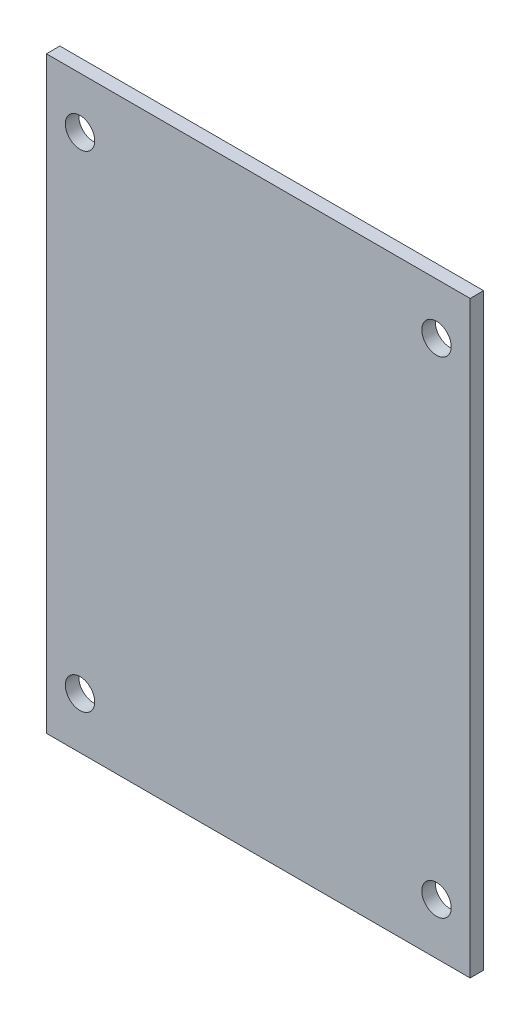
ISO-10303-21;
HEADER;
FILE_DESCRIPTION(('STEP AP214'),'2;1');
FILE_NAME('part.step','',(''),(''),'','','');
FILE_SCHEMA(('AUTOMOTIVE_DESIGN { 1 0 10303 214 1 1 1 1 }'));
ENDSEC;
DATA;
#1=APPLICATION_CONTEXT('core data for automotive mechanical design processes');
#2=APPLICATION_PROTOCOL_DEFINITION('international standard','automotive_design',2000,#1);
#3=PRODUCT_CONTEXT('',#1,'mechanical');
#4=PRODUCT('Part','Part','',(#3));
#5=PRODUCT_RELATED_PRODUCT_CATEGORY('part','',(#4));
#6=PRODUCT_DEFINITION_FORMATION('','',#4);
#7=PRODUCT_DEFINITION_CONTEXT('part definition',#1,'design');
#8=PRODUCT_DEFINITION('design','',#6,#7);
#9=PRODUCT_DEFINITION_SHAPE('','',#8);
#10=(LENGTH_UNIT() NAMED_UNIT(*) SI_UNIT(.MILLI.,.METRE.));
#11=(NAMED_UNIT(*) PLANE_ANGLE_UNIT() SI_UNIT($,.RADIAN.));
#12=(NAMED_UNIT(*) SI_UNIT($,.STERADIAN.) SOLID_ANGLE_UNIT());
#13=UNCERTAINTY_MEASURE_WITH_UNIT(LENGTH_MEASURE(1.E-05),#10,'distance_accuracy_value','');
#14=(GEOMETRIC_REPRESENTATION_CONTEXT(3) GLOBAL_UNCERTAINTY_ASSIGNED_CONTEXT((#13)) GLOBAL_UNIT_ASSIGNED_CONTEXT((#10,
#11,#12)) REPRESENTATION_CONTEXT('',''));
#15=CARTESIAN_POINT('',(0.,0.,0.));
#16=DIRECTION('',(0.,0.,1.));
#17=DIRECTION('',(1.,0.,0.));
#18=AXIS2_PLACEMENT_3D('',#15,#16,#17);
#19=CARTESIAN_POINT('',(0.,0.,1.6));
#20=DIRECTION('',(1.,0.,0.));
#21=DIRECTION('',(0.,0.,-1.));
#22=AXIS2_PLACEMENT_3D('',#19,#20,#21);
#23=PLANE('',#22);
#24=DIRECTION('',(0.,-1.,0.));
#25=VECTOR('',#24,1.);
#26=CARTESIAN_POINT('',(0.,0.,0.));
#27=LINE('',#26,#25);
#28=CARTESIAN_POINT('',(0.,70.,0.));
#29=VERTEX_POINT('',#28);
#30=CARTESIAN_POINT('',(0.,0.,0.));
#31=VERTEX_POINT('',#30);
#32=EDGE_CURVE('E96',#29,#31,#27,.T.);
#33=ORIENTED_EDGE('',*,*,#32,.T.);
#34=DIRECTION('',(0.,0.,-1.));
#35=VECTOR('',#34,1.);
#36=CARTESIAN_POINT('',(0.,0.,1.6));
#37=LINE('',#36,#35);
#38=CARTESIAN_POINT('',(0.,0.,1.6));
#39=VERTEX_POINT('',#38);
#40=EDGE_CURVE('E11',#39,#31,#37,.T.);
#41=ORIENTED_EDGE('',*,*,#40,.F.);
#42=DIRECTION('',(0.,-1.,0.));
#43=VECTOR('',#42,1.);
#44=CARTESIAN_POINT('',(0.,0.,1.6));
#45=LINE('',#44,#43);
#46=CARTESIAN_POINT('',(0.,70.,1.6));
#47=VERTEX_POINT('',#46);
#48=EDGE_CURVE('E84',#47,#39,#45,.T.);
#49=ORIENTED_EDGE('',*,*,#48,.F.);
#50=DIRECTION('',(0.,0.,-1.));
#51=VECTOR('',#50,1.);
#52=CARTESIAN_POINT('',(0.,70.,1.6));
#53=LINE('',#52,#51);
#54=EDGE_CURVE('E92',#47,#29,#53,.T.);
#55=ORIENTED_EDGE('',*,*,#54,.T.);
#56=EDGE_LOOP('',(#33,#41,#49,#55));
#57=FACE_BOUND('',#56,.T.);
#58=ADVANCED_FACE('F33',(#57),#23,.F.);
#59=CARTESIAN_POINT('',(0.,0.,1.6));
#60=DIRECTION('',(0.,1.,0.));
#61=DIRECTION('',(0.,0.,1.));
#62=AXIS2_PLACEMENT_3D('',#59,#60,#61);
#63=PLANE('',#62);
#64=DIRECTION('',(1.,0.,0.));
#65=VECTOR('',#64,1.);
#66=CARTESIAN_POINT('',(0.,0.,0.));
#67=LINE('',#66,#65);
#68=CARTESIAN_POINT('',(50.4,0.,0.));
#69=VERTEX_POINT('',#68);
#70=EDGE_CURVE('E88',#31,#69,#67,.T.);
#71=ORIENTED_EDGE('',*,*,#70,.T.);
#72=DIRECTION('',(0.,0.,-1.));
#73=VECTOR('',#72,1.);
#74=CARTESIAN_POINT('',(50.4,0.,1.6));
#75=LINE('',#74,#73);
#76=CARTESIAN_POINT('',(50.4,0.,1.6));
#77=VERTEX_POINT('',#76);
#78=EDGE_CURVE('E41',#77,#69,#75,.T.);
#79=ORIENTED_EDGE('',*,*,#78,.F.);
#80=DIRECTION('',(1.,0.,0.));
#81=VECTOR('',#80,1.);
#82=CARTESIAN_POINT('',(0.,0.,1.6));
#83=LINE('',#82,#81);
#84=EDGE_CURVE('E79',#39,#77,#83,.T.);
#85=ORIENTED_EDGE('',*,*,#84,.F.);
#86=ORIENTED_EDGE('',*,*,#40,.T.);
#87=EDGE_LOOP('',(#71,#79,#85,#86));
#88=FACE_BOUND('',#87,.T.);
#89=ADVANCED_FACE('F87',(#88),#63,.F.);
#90=CARTESIAN_POINT('',(50.4,0.,1.6));
#91=DIRECTION('',(-1.,0.,0.));
#92=DIRECTION('',(0.,0.,1.));
#93=AXIS2_PLACEMENT_3D('',#90,#91,#92);
#94=PLANE('',#93);
#95=DIRECTION('',(0.,1.,0.));
#96=VECTOR('',#95,1.);
#97=CARTESIAN_POINT('',(50.4,0.,0.));
#98=LINE('',#97,#96);
#99=CARTESIAN_POINT('',(50.4,70.,0.));
#100=VERTEX_POINT('',#99);
#101=EDGE_CURVE('E66',#69,#100,#98,.T.);
#102=ORIENTED_EDGE('',*,*,#101,.T.);
#103=DIRECTION('',(0.,0.,-1.));
#104=VECTOR('',#103,1.);
#105=CARTESIAN_POINT('',(50.4,70.,1.6));
#106=LINE('',#105,#104);
#107=CARTESIAN_POINT('',(50.4,70.,1.6));
#108=VERTEX_POINT('',#107);
#109=EDGE_CURVE('E89',#108,#100,#106,.T.);
#110=ORIENTED_EDGE('',*,*,#109,.F.);
#111=DIRECTION('',(0.,1.,0.));
#112=VECTOR('',#111,1.);
#113=CARTESIAN_POINT('',(50.4,0.,1.6));
#114=LINE('',#113,#112);
#115=EDGE_CURVE('E82',#77,#108,#114,.T.);
#116=ORIENTED_EDGE('',*,*,#115,.F.);
#117=ORIENTED_EDGE('',*,*,#78,.T.);
#118=EDGE_LOOP('',(#102,#110,#116,#117));
#119=FACE_BOUND('',#118,.T.);
#120=ADVANCED_FACE('F90',(#119),#94,.F.);
#121=CARTESIAN_POINT('',(0.,70.,1.6));
#122=DIRECTION('',(0.,-1.,0.));
#123=DIRECTION('',(0.,0.,-1.));
#124=AXIS2_PLACEMENT_3D('',#121,#122,#123);
#125=PLANE('',#124);
#126=DIRECTION('',(-1.,0.,0.));
#127=VECTOR('',#126,1.);
#128=CARTESIAN_POINT('',(0.,70.,0.));
#129=LINE('',#128,#127);
#130=EDGE_CURVE('E72',#100,#29,#129,.T.);
#131=ORIENTED_EDGE('',*,*,#130,.T.);
#132=ORIENTED_EDGE('',*,*,#54,.F.);
#133=DIRECTION('',(-1.,0.,0.));
#134=VECTOR('',#133,1.);
#135=CARTESIAN_POINT('',(0.,70.,1.6));
#136=LINE('',#135,#134);
#137=EDGE_CURVE('E49',#108,#47,#136,.T.);
#138=ORIENTED_EDGE('',*,*,#137,.F.);
#139=ORIENTED_EDGE('',*,*,#109,.T.);
#140=EDGE_LOOP('',(#131,#132,#138,#139));
#141=FACE_BOUND('',#140,.T.);
#142=ADVANCED_FACE('F104',(#141),#125,.F.);
#143=CARTESIAN_POINT('',(0.,0.,1.6));
#144=DIRECTION('',(0.,0.,-1.));
#145=DIRECTION('',(-1.,0.,0.));
#146=AXIS2_PLACEMENT_3D('',#143,#144,#145);
#147=PLANE('',#146);
#148=CARTESIAN_POINT('',(4.,6.10000000000001,1.6));
#149=DIRECTION('',(0.,0.,-1.));
#150=DIRECTION('',(1.,0.,0.));
#151=AXIS2_PLACEMENT_3D('',#148,#149,#150);
#152=CIRCLE('',#151,1.75);
#153=CARTESIAN_POINT('',(5.75,6.10000000000001,1.6));
#154=VERTEX_POINT('',#153);
#155=EDGE_CURVE('E128',#154,#154,#152,.T.);
#156=ORIENTED_EDGE('',*,*,#155,.T.);
#157=EDGE_LOOP('',(#156));
#158=FACE_BOUND('',#157,.T.);
#159=CARTESIAN_POINT('',(46.4,6.10000000000001,1.6));
#160=DIRECTION('',(0.,0.,1.));
#161=DIRECTION('',(-1.,0.,0.));
#162=AXIS2_PLACEMENT_3D('',#159,#160,#161);
#163=CIRCLE('',#162,1.75);
#164=CARTESIAN_POINT('',(44.65,6.10000000000001,1.6));
#165=VERTEX_POINT('',#164);
#166=EDGE_CURVE('E122',#165,#165,#163,.T.);
#167=ORIENTED_EDGE('',*,*,#166,.F.);
#168=EDGE_LOOP('',(#167));
#169=FACE_BOUND('',#168,.T.);
#170=CARTESIAN_POINT('',(46.4,63.9,1.6));
#171=DIRECTION('',(0.,0.,-1.));
#172=DIRECTION('',(-1.,0.,0.));
#173=AXIS2_PLACEMENT_3D('',#170,#171,#172);
#174=CIRCLE('',#173,1.75);
#175=CARTESIAN_POINT('',(44.65,63.9,1.6));
#176=VERTEX_POINT('',#175);
#177=EDGE_CURVE('E116',#176,#176,#174,.T.);
#178=ORIENTED_EDGE('',*,*,#177,.T.);
#179=EDGE_LOOP('',(#178));
#180=FACE_BOUND('',#179,.T.);
#181=CARTESIAN_POINT('',(4.,63.9,1.6));
#182=DIRECTION('',(0.,0.,1.));
#183=DIRECTION('',(1.,0.,0.));
#184=AXIS2_PLACEMENT_3D('',#181,#182,#183);
#185=CIRCLE('',#184,1.75);
#186=CARTESIAN_POINT('',(5.75,63.9,1.6));
#187=VERTEX_POINT('',#186);
#188=EDGE_CURVE('E110',#187,#187,#185,.T.);
#189=ORIENTED_EDGE('',*,*,#188,.F.);
#190=EDGE_LOOP('',(#189));
#191=FACE_BOUND('',#190,.T.);
#192=ORIENTED_EDGE('',*,*,#48,.T.);
#193=ORIENTED_EDGE('',*,*,#84,.T.);
#194=ORIENTED_EDGE('',*,*,#115,.T.);
#195=ORIENTED_EDGE('',*,*,#137,.T.);
#196=EDGE_LOOP('',(#192,#193,#194,#195));
#197=FACE_BOUND('',#196,.T.);
#198=ADVANCED_FACE('F80',(#158,#169,#180,#191,#197),#147,.F.);
#199=CARTESIAN_POINT('',(0.,0.,0.));
#200=DIRECTION('',(0.,0.,-1.));
#201=DIRECTION('',(-1.,0.,0.));
#202=AXIS2_PLACEMENT_3D('',#199,#200,#201);
#203=PLANE('',#202);
#204=CARTESIAN_POINT('',(4.,6.10000000000001,0.));
#205=DIRECTION('',(0.,0.,-1.));
#206=DIRECTION('',(1.,0.,0.));
#207=AXIS2_PLACEMENT_3D('',#204,#205,#206);
#208=CIRCLE('',#207,1.75);
#209=CARTESIAN_POINT('',(5.75,6.10000000000001,0.));
#210=VERTEX_POINT('',#209);
#211=EDGE_CURVE('E125',#210,#210,#208,.T.);
#212=ORIENTED_EDGE('',*,*,#211,.F.);
#213=EDGE_LOOP('',(#212));
#214=FACE_BOUND('',#213,.T.);
#215=CARTESIAN_POINT('',(46.4,6.10000000000001,0.));
#216=DIRECTION('',(0.,0.,1.));
#217=DIRECTION('',(-1.,0.,0.));
#218=AXIS2_PLACEMENT_3D('',#215,#216,#217);
#219=CIRCLE('',#218,1.75);
#220=CARTESIAN_POINT('',(44.65,6.10000000000001,0.));
#221=VERTEX_POINT('',#220);
#222=EDGE_CURVE('E119',#221,#221,#219,.T.);
#223=ORIENTED_EDGE('',*,*,#222,.T.);
#224=EDGE_LOOP('',(#223));
#225=FACE_BOUND('',#224,.T.);
#226=CARTESIAN_POINT('',(46.4,63.9,0.));
#227=DIRECTION('',(0.,0.,-1.));
#228=DIRECTION('',(-1.,0.,0.));
#229=AXIS2_PLACEMENT_3D('',#226,#227,#228);
#230=CIRCLE('',#229,1.75);
#231=CARTESIAN_POINT('',(44.65,63.9,0.));
#232=VERTEX_POINT('',#231);
#233=EDGE_CURVE('E113',#232,#232,#230,.T.);
#234=ORIENTED_EDGE('',*,*,#233,.F.);
#235=EDGE_LOOP('',(#234));
#236=FACE_BOUND('',#235,.T.);
#237=CARTESIAN_POINT('',(4.,63.9,0.));
#238=DIRECTION('',(0.,0.,1.));
#239=DIRECTION('',(1.,0.,0.));
#240=AXIS2_PLACEMENT_3D('',#237,#238,#239);
#241=CIRCLE('',#240,1.75);
#242=CARTESIAN_POINT('',(5.75,63.9,0.));
#243=VERTEX_POINT('',#242);
#244=EDGE_CURVE('E99',#243,#243,#241,.T.);
#245=ORIENTED_EDGE('',*,*,#244,.T.);
#246=EDGE_LOOP('',(#245));
#247=FACE_BOUND('',#246,.T.);
#248=ORIENTED_EDGE('',*,*,#32,.F.);
#249=ORIENTED_EDGE('',*,*,#130,.F.);
#250=ORIENTED_EDGE('',*,*,#101,.F.);
#251=ORIENTED_EDGE('',*,*,#70,.F.);
#252=EDGE_LOOP('',(#248,#249,#250,#251));
#253=FACE_BOUND('',#252,.T.);
#254=ADVANCED_FACE('F107',(#214,#225,#236,#247,#253),#203,.T.);
#255=CARTESIAN_POINT('',(4.,63.9,0.));
#256=DIRECTION('',(0.,0.,1.));
#257=DIRECTION('',(1.,0.,0.));
#258=AXIS2_PLACEMENT_3D('',#255,#256,#257);
#259=CYLINDRICAL_SURFACE('',#258,1.75);
#260=ORIENTED_EDGE('',*,*,#244,.F.);
#261=EDGE_LOOP('',(#260));
#262=FACE_BOUND('',#261,.T.);
#263=ORIENTED_EDGE('',*,*,#188,.T.);
#264=EDGE_LOOP('',(#263));
#265=FACE_BOUND('',#264,.T.);
#266=ADVANCED_FACE('F139',(#262,#265),#259,.F.);
#267=CARTESIAN_POINT('',(46.4,63.9,0.));
#268=DIRECTION('',(0.,0.,1.));
#269=DIRECTION('',(1.,0.,0.));
#270=AXIS2_PLACEMENT_3D('',#267,#268,#269);
#271=CYLINDRICAL_SURFACE('',#270,1.75);
#272=ORIENTED_EDGE('',*,*,#233,.T.);
#273=EDGE_LOOP('',(#272));
#274=FACE_BOUND('',#273,.T.);
#275=ORIENTED_EDGE('',*,*,#177,.F.);
#276=EDGE_LOOP('',(#275));
#277=FACE_BOUND('',#276,.T.);
#278=ADVANCED_FACE('F149',(#274,#277),#271,.F.);
#279=CARTESIAN_POINT('',(46.4,6.10000000000001,0.));
#280=DIRECTION('',(0.,0.,1.));
#281=DIRECTION('',(1.,0.,0.));
#282=AXIS2_PLACEMENT_3D('',#279,#280,#281);
#283=CYLINDRICAL_SURFACE('',#282,1.75);
#284=ORIENTED_EDGE('',*,*,#222,.F.);
#285=EDGE_LOOP('',(#284));
#286=FACE_BOUND('',#285,.T.);
#287=ORIENTED_EDGE('',*,*,#166,.T.);
#288=EDGE_LOOP('',(#287));
#289=FACE_BOUND('',#288,.T.);
#290=ADVANCED_FACE('F191',(#286,#289),#283,.F.);
#291=CARTESIAN_POINT('',(4.,6.10000000000001,0.));
#292=DIRECTION('',(0.,0.,1.));
#293=DIRECTION('',(1.,0.,0.));
#294=AXIS2_PLACEMENT_3D('',#291,#292,#293);
#295=CYLINDRICAL_SURFACE('',#294,1.75);
#296=ORIENTED_EDGE('',*,*,#211,.T.);
#297=EDGE_LOOP('',(#296));
#298=FACE_BOUND('',#297,.T.);
#299=ORIENTED_EDGE('',*,*,#155,.F.);
#300=EDGE_LOOP('',(#299));
#301=FACE_BOUND('',#300,.T.);
#302=ADVANCED_FACE('F134',(#298,#301),#295,.F.);
#303=CLOSED_SHELL('',(#58,#89,#120,#142,#198,#254,#266,#278,#290,#302));
#304=MANIFOLD_SOLID_BREP('B2',#303);
#305=ADVANCED_BREP_SHAPE_REPRESENTATION('',(#18,#304),#14);
#306=SHAPE_DEFINITION_REPRESENTATION(#9,#305);
ENDSEC;
END-ISO-10303-21;
